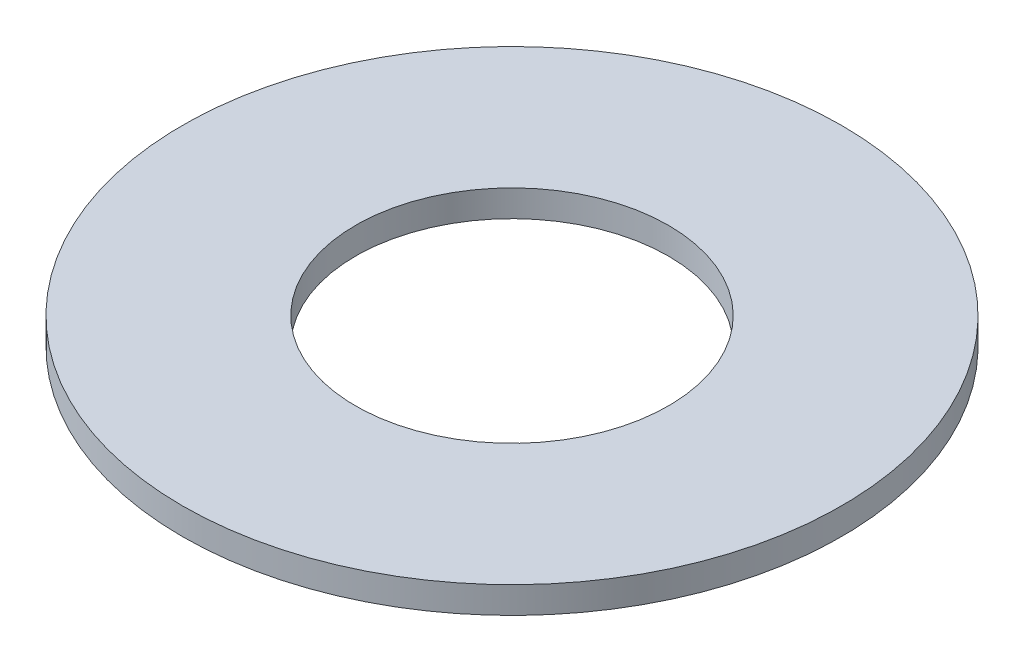
ISO-10303-21;
HEADER;
FILE_DESCRIPTION(('STEP AP214'),'2;1');
FILE_NAME('part.step','',(''),(''),'','','');
FILE_SCHEMA(('AUTOMOTIVE_DESIGN { 1 0 10303 214 1 1 1 1 }'));
ENDSEC;
DATA;
#1=APPLICATION_CONTEXT('core data for automotive mechanical design processes');
#2=APPLICATION_PROTOCOL_DEFINITION('international standard','automotive_design',2000,#1);
#3=PRODUCT_CONTEXT('',#1,'mechanical');
#4=PRODUCT('Part','Part','',(#3));
#5=PRODUCT_RELATED_PRODUCT_CATEGORY('part','',(#4));
#6=PRODUCT_DEFINITION_FORMATION('','',#4);
#7=PRODUCT_DEFINITION_CONTEXT('part definition',#1,'design');
#8=PRODUCT_DEFINITION('design','',#6,#7);
#9=PRODUCT_DEFINITION_SHAPE('','',#8);
#10=(LENGTH_UNIT() NAMED_UNIT(*) SI_UNIT(.MILLI.,.METRE.));
#11=(NAMED_UNIT(*) PLANE_ANGLE_UNIT() SI_UNIT($,.RADIAN.));
#12=(NAMED_UNIT(*) SI_UNIT($,.STERADIAN.) SOLID_ANGLE_UNIT());
#13=UNCERTAINTY_MEASURE_WITH_UNIT(LENGTH_MEASURE(1.E-05),#10,'distance_accuracy_value','');
#14=(GEOMETRIC_REPRESENTATION_CONTEXT(3) GLOBAL_UNCERTAINTY_ASSIGNED_CONTEXT((#13)) GLOBAL_UNIT_ASSIGNED_CONTEXT((#10,
#11,#12)) REPRESENTATION_CONTEXT('',''));
#15=CARTESIAN_POINT('',(0.,0.,0.));
#16=DIRECTION('',(0.,0.,1.));
#17=DIRECTION('',(1.,0.,0.));
#18=AXIS2_PLACEMENT_3D('',#15,#16,#17);
#19=CARTESIAN_POINT('',(0.,1.,0.));
#20=DIRECTION('',(0.,-1.,0.));
#21=DIRECTION('',(0.,0.,-1.));
#22=AXIS2_PLACEMENT_3D('',#19,#20,#21);
#23=CYLINDRICAL_SURFACE('',#22,12.36);
#24=CARTESIAN_POINT('',(0.,1.,0.));
#25=DIRECTION('',(0.,1.,0.));
#26=DIRECTION('',(0.,0.,1.));
#27=AXIS2_PLACEMENT_3D('',#24,#25,#26);
#28=CIRCLE('',#27,12.36);
#29=CARTESIAN_POINT('',(0.,1.,12.36));
#30=VERTEX_POINT('',#29);
#31=EDGE_CURVE('E10',#30,#30,#28,.T.);
#32=ORIENTED_EDGE('',*,*,#31,.F.);
#33=EDGE_LOOP('',(#32));
#34=FACE_BOUND('',#33,.T.);
#35=CARTESIAN_POINT('',(0.,0.,0.));
#36=DIRECTION('',(0.,1.,0.));
#37=DIRECTION('',(0.,0.,1.));
#38=AXIS2_PLACEMENT_3D('',#35,#36,#37);
#39=CIRCLE('',#38,12.36);
#40=CARTESIAN_POINT('',(0.,0.,12.36));
#41=VERTEX_POINT('',#40);
#42=EDGE_CURVE('E46',#41,#41,#39,.T.);
#43=ORIENTED_EDGE('',*,*,#42,.T.);
#44=EDGE_LOOP('',(#43));
#45=FACE_BOUND('',#44,.T.);
#46=ADVANCED_FACE('F43',(#34,#45),#23,.T.);
#47=CARTESIAN_POINT('',(0.,1.,0.));
#48=DIRECTION('',(0.,1.,0.));
#49=DIRECTION('',(0.,0.,1.));
#50=AXIS2_PLACEMENT_3D('',#47,#48,#49);
#51=PLANE('',#50);
#52=CARTESIAN_POINT('',(0.,1.,0.));
#53=DIRECTION('',(0.,-1.,0.));
#54=DIRECTION('',(0.,0.,-1.));
#55=AXIS2_PLACEMENT_3D('',#52,#53,#54);
#56=CIRCLE('',#55,5.8674);
#57=CARTESIAN_POINT('',(0.,1.,-5.8674));
#58=VERTEX_POINT('',#57);
#59=EDGE_CURVE('E55',#58,#58,#56,.T.);
#60=ORIENTED_EDGE('',*,*,#59,.T.);
#61=EDGE_LOOP('',(#60));
#62=FACE_BOUND('',#61,.T.);
#63=ORIENTED_EDGE('',*,*,#31,.T.);
#64=EDGE_LOOP('',(#63));
#65=FACE_BOUND('',#64,.T.);
#66=ADVANCED_FACE('F65',(#62,#65),#51,.T.);
#67=CARTESIAN_POINT('',(0.,0.,0.));
#68=DIRECTION('',(0.,1.,0.));
#69=DIRECTION('',(0.,0.,1.));
#70=AXIS2_PLACEMENT_3D('',#67,#68,#69);
#71=PLANE('',#70);
#72=CARTESIAN_POINT('',(0.,0.,0.));
#73=DIRECTION('',(0.,-1.,0.));
#74=DIRECTION('',(0.,0.,-1.));
#75=AXIS2_PLACEMENT_3D('',#72,#73,#74);
#76=CIRCLE('',#75,5.8674);
#77=CARTESIAN_POINT('',(0.,0.,-5.8674));
#78=VERTEX_POINT('',#77);
#79=EDGE_CURVE('E57',#78,#78,#76,.T.);
#80=ORIENTED_EDGE('',*,*,#79,.F.);
#81=EDGE_LOOP('',(#80));
#82=FACE_BOUND('',#81,.T.);
#83=ORIENTED_EDGE('',*,*,#42,.F.);
#84=EDGE_LOOP('',(#83));
#85=FACE_BOUND('',#84,.T.);
#86=ADVANCED_FACE('F70',(#82,#85),#71,.F.);
#87=CARTESIAN_POINT('',(0.,1.,0.));
#88=DIRECTION('',(0.,-1.,0.));
#89=DIRECTION('',(0.,0.,-1.));
#90=AXIS2_PLACEMENT_3D('',#87,#88,#89);
#91=CYLINDRICAL_SURFACE('',#90,5.8674);
#92=ORIENTED_EDGE('',*,*,#59,.F.);
#93=EDGE_LOOP('',(#92));
#94=FACE_BOUND('',#93,.T.);
#95=ORIENTED_EDGE('',*,*,#79,.T.);
#96=EDGE_LOOP('',(#95));
#97=FACE_BOUND('',#96,.T.);
#98=ADVANCED_FACE('F67',(#94,#97),#91,.F.);
#99=CLOSED_SHELL('',(#46,#66,#86,#98));
#100=MANIFOLD_SOLID_BREP('B2',#99);
#101=ADVANCED_BREP_SHAPE_REPRESENTATION('',(#18,#100),#14);
#102=SHAPE_DEFINITION_REPRESENTATION(#9,#101);
ENDSEC;
END-ISO-10303-21;
